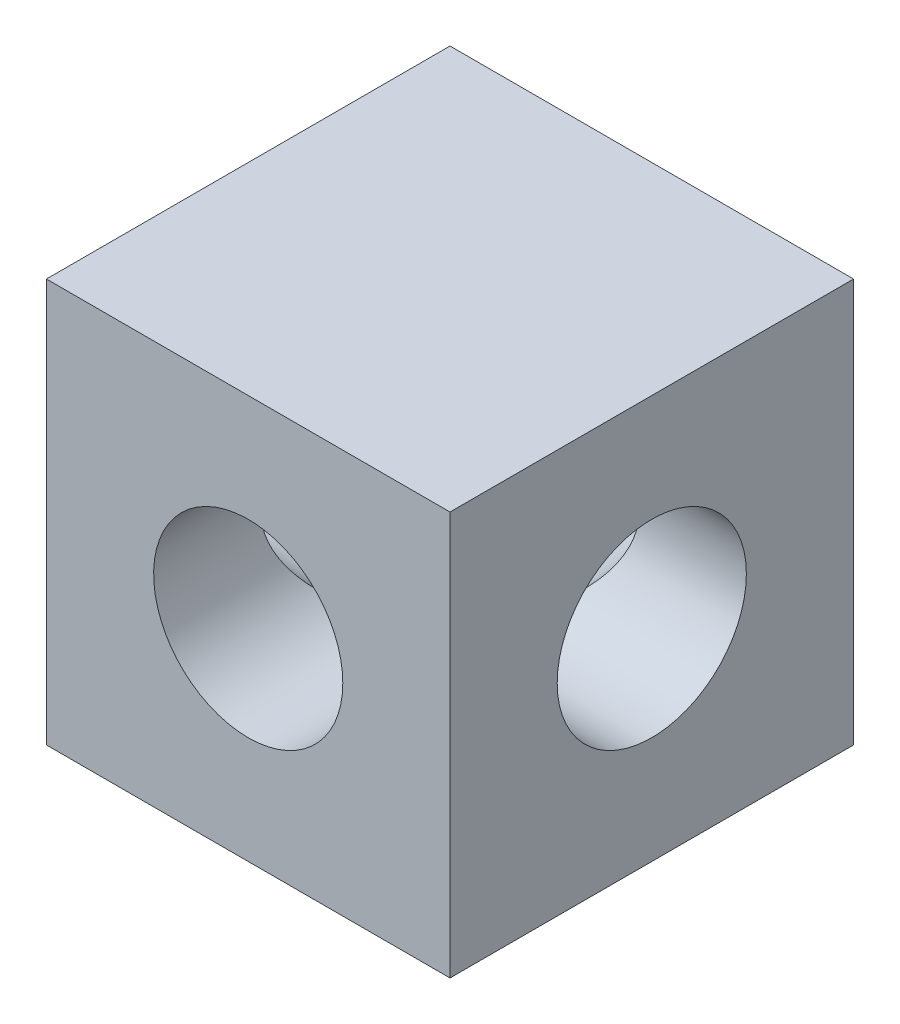
ISO-10303-21;
HEADER;
FILE_DESCRIPTION(('STEP AP214'),'2;1');
FILE_NAME('part.step','',(''),(''),'','','');
FILE_SCHEMA(('AUTOMOTIVE_DESIGN { 1 0 10303 214 1 1 1 1 }'));
ENDSEC;
DATA;
#1=APPLICATION_CONTEXT('core data for automotive mechanical design processes');
#2=APPLICATION_PROTOCOL_DEFINITION('international standard','automotive_design',2000,#1);
#3=PRODUCT_CONTEXT('',#1,'mechanical');
#4=PRODUCT('Part','Part','',(#3));
#5=PRODUCT_RELATED_PRODUCT_CATEGORY('part','',(#4));
#6=PRODUCT_DEFINITION_FORMATION('','',#4);
#7=PRODUCT_DEFINITION_CONTEXT('part definition',#1,'design');
#8=PRODUCT_DEFINITION('design','',#6,#7);
#9=PRODUCT_DEFINITION_SHAPE('','',#8);
#10=(LENGTH_UNIT() NAMED_UNIT(*) SI_UNIT(.MILLI.,.METRE.));
#11=(NAMED_UNIT(*) PLANE_ANGLE_UNIT() SI_UNIT($,.RADIAN.));
#12=(NAMED_UNIT(*) SI_UNIT($,.STERADIAN.) SOLID_ANGLE_UNIT());
#13=UNCERTAINTY_MEASURE_WITH_UNIT(LENGTH_MEASURE(1.E-05),#10,'distance_accuracy_value','');
#14=(GEOMETRIC_REPRESENTATION_CONTEXT(3) GLOBAL_UNCERTAINTY_ASSIGNED_CONTEXT((#13)) GLOBAL_UNIT_ASSIGNED_CONTEXT((#10,
#11,#12)) REPRESENTATION_CONTEXT('',''));
#15=CARTESIAN_POINT('',(0.,0.,0.));
#16=DIRECTION('',(0.,0.,1.));
#17=DIRECTION('',(1.,0.,0.));
#18=AXIS2_PLACEMENT_3D('',#15,#16,#17);
#19=CARTESIAN_POINT('',(0.,0.,10.16));
#20=DIRECTION('',(0.,0.,-0.999999999999999));
#21=DIRECTION('',(-1.,0.,0.));
#22=AXIS2_PLACEMENT_3D('',#19,#20,#21);
#23=CYLINDRICAL_SURFACE('',#22,4.7625);
#24=CARTESIAN_POINT('',(0.,0.,0.));
#25=DIRECTION('',(0.70710678118655,0.,-0.707106781186548));
#26=DIRECTION('',(-0.707106781186547,0.,-0.707106781186546));
#27=AXIS2_PLACEMENT_3D('',#24,#25,#26);
#28=ELLIPSE('',#27,6.73519209080187,4.7625);
#29=CARTESIAN_POINT('',(0.,-4.76250000000001,0.));
#30=VERTEX_POINT('',#29);
#31=CARTESIAN_POINT('',(0.,4.76250000000007,0.));
#32=VERTEX_POINT('',#31);
#33=EDGE_CURVE('E11',#30,#32,#28,.F.);
#34=ORIENTED_EDGE('',*,*,#33,.F.);
#35=CARTESIAN_POINT('',(0.,0.,0.));
#36=DIRECTION('',(-0.707106781186547,0.,-0.707106781186546));
#37=DIRECTION('',(0.70710678118655,0.,-0.707106781186548));
#38=AXIS2_PLACEMENT_3D('',#35,#36,#37);
#39=ELLIPSE('',#38,6.73519209080187,4.7625);
#40=EDGE_CURVE('E48',#32,#30,#39,.F.);
#41=ORIENTED_EDGE('',*,*,#40,.F.);
#42=EDGE_LOOP('',(#34,#41));
#43=FACE_BOUND('',#42,.T.);
#44=CARTESIAN_POINT('',(0.,0.,10.16));
#45=DIRECTION('',(0.,0.,0.999999999999999));
#46=DIRECTION('',(1.,0.,0.));
#47=AXIS2_PLACEMENT_3D('',#44,#45,#46);
#48=CIRCLE('',#47,4.7625);
#49=CARTESIAN_POINT('',(4.7625,0.,10.16));
#50=VERTEX_POINT('',#49);
#51=EDGE_CURVE('E125',#50,#50,#48,.T.);
#52=ORIENTED_EDGE('',*,*,#51,.T.);
#53=EDGE_LOOP('',(#52));
#54=FACE_BOUND('',#53,.T.);
#55=ADVANCED_FACE('F34',(#43,#54),#23,.F.);
#56=CARTESIAN_POINT('',(-10.16,10.16,10.16));
#57=DIRECTION('',(0.,0.,0.999999999999999));
#58=DIRECTION('',(1.,0.,0.));
#59=AXIS2_PLACEMENT_3D('',#56,#57,#58);
#60=PLANE('',#59);
#61=DIRECTION('',(0.,1.,0.));
#62=VECTOR('',#61,1.);
#63=CARTESIAN_POINT('',(-10.1600000000001,-10.16,10.16));
#64=LINE('',#63,#62);
#65=CARTESIAN_POINT('',(-10.1600000000001,-10.16,10.16));
#66=VERTEX_POINT('',#65);
#67=CARTESIAN_POINT('',(-10.16,10.16,10.16));
#68=VERTEX_POINT('',#67);
#69=EDGE_CURVE('E110',#66,#68,#64,.T.);
#70=ORIENTED_EDGE('',*,*,#69,.F.);
#71=DIRECTION('',(1.,0.,0.));
#72=VECTOR('',#71,1.);
#73=CARTESIAN_POINT('',(-10.1600000000001,-10.16,10.16));
#74=LINE('',#73,#72);
#75=CARTESIAN_POINT('',(10.16,-10.16,10.16));
#76=VERTEX_POINT('',#75);
#77=EDGE_CURVE('E99',#66,#76,#74,.T.);
#78=ORIENTED_EDGE('',*,*,#77,.T.);
#79=DIRECTION('',(0.,-1.,0.));
#80=VECTOR('',#79,1.);
#81=CARTESIAN_POINT('',(10.16,10.16,10.16));
#82=LINE('',#81,#80);
#83=CARTESIAN_POINT('',(10.16,10.16,10.16));
#84=VERTEX_POINT('',#83);
#85=EDGE_CURVE('E105',#84,#76,#82,.T.);
#86=ORIENTED_EDGE('',*,*,#85,.F.);
#87=DIRECTION('',(-1.,0.,0.));
#88=VECTOR('',#87,1.);
#89=CARTESIAN_POINT('',(10.16,10.16,10.16));
#90=LINE('',#89,#88);
#91=EDGE_CURVE('E108',#84,#68,#90,.T.);
#92=ORIENTED_EDGE('',*,*,#91,.T.);
#93=EDGE_LOOP('',(#70,#78,#86,#92));
#94=FACE_BOUND('',#93,.T.);
#95=ORIENTED_EDGE('',*,*,#51,.F.);
#96=EDGE_LOOP('',(#95));
#97=FACE_BOUND('',#96,.T.);
#98=ADVANCED_FACE('F157',(#94,#97),#60,.T.);
#99=CARTESIAN_POINT('',(-10.16,10.1600000000001,-10.16));
#100=DIRECTION('',(0.,0.,0.999999999999999));
#101=DIRECTION('',(1.,0.,0.));
#102=AXIS2_PLACEMENT_3D('',#99,#100,#101);
#103=PLANE('',#102);
#104=DIRECTION('',(0.,1.,0.));
#105=VECTOR('',#104,1.);
#106=CARTESIAN_POINT('',(-10.16,-10.16,-10.16));
#107=LINE('',#106,#105);
#108=CARTESIAN_POINT('',(-10.16,-10.16,-10.16));
#109=VERTEX_POINT('',#108);
#110=CARTESIAN_POINT('',(-10.16,10.1600000000001,-10.16));
#111=VERTEX_POINT('',#110);
#112=EDGE_CURVE('E122',#109,#111,#107,.T.);
#113=ORIENTED_EDGE('',*,*,#112,.T.);
#114=DIRECTION('',(-1.,0.,0.));
#115=VECTOR('',#114,1.);
#116=CARTESIAN_POINT('',(10.16,10.16,-10.16));
#117=LINE('',#116,#115);
#118=CARTESIAN_POINT('',(10.16,10.16,-10.16));
#119=VERTEX_POINT('',#118);
#120=EDGE_CURVE('E119',#119,#111,#117,.T.);
#121=ORIENTED_EDGE('',*,*,#120,.F.);
#122=DIRECTION('',(0.,-1.,0.));
#123=VECTOR('',#122,1.);
#124=CARTESIAN_POINT('',(10.16,10.16,-10.16));
#125=LINE('',#124,#123);
#126=CARTESIAN_POINT('',(10.16,-10.16,-10.16));
#127=VERTEX_POINT('',#126);
#128=EDGE_CURVE('E116',#119,#127,#125,.T.);
#129=ORIENTED_EDGE('',*,*,#128,.T.);
#130=DIRECTION('',(1.,0.,0.));
#131=VECTOR('',#130,1.);
#132=CARTESIAN_POINT('',(-10.16,-10.16,-10.16));
#133=LINE('',#132,#131);
#134=EDGE_CURVE('E113',#109,#127,#133,.T.);
#135=ORIENTED_EDGE('',*,*,#134,.F.);
#136=EDGE_LOOP('',(#113,#121,#129,#135));
#137=FACE_BOUND('',#136,.T.);
#138=CARTESIAN_POINT('',(0.,0.,-10.16));
#139=DIRECTION('',(0.,0.,0.999999999999999));
#140=DIRECTION('',(1.,0.,0.));
#141=AXIS2_PLACEMENT_3D('',#138,#139,#140);
#142=CIRCLE('',#141,4.7625);
#143=CARTESIAN_POINT('',(4.76250000000001,0.,-10.16));
#144=VERTEX_POINT('',#143);
#145=EDGE_CURVE('E128',#144,#144,#142,.T.);
#146=ORIENTED_EDGE('',*,*,#145,.T.);
#147=EDGE_LOOP('',(#146));
#148=FACE_BOUND('',#147,.T.);
#149=ADVANCED_FACE('F150',(#137,#148),#103,.F.);
#150=CARTESIAN_POINT('',(-10.1600000000001,-10.16,10.16));
#151=DIRECTION('',(-1.,0.,0.));
#152=DIRECTION('',(0.,-1.,0.));
#153=AXIS2_PLACEMENT_3D('',#150,#151,#152);
#154=PLANE('',#153);
#155=CARTESIAN_POINT('',(-10.16,0.,0.));
#156=DIRECTION('',(1.,0.,0.));
#157=DIRECTION('',(0.,0.,-0.999999999999999));
#158=AXIS2_PLACEMENT_3D('',#155,#156,#157);
#159=CIRCLE('',#158,4.7625);
#160=CARTESIAN_POINT('',(-10.16,0.,-4.76249999999997));
#161=VERTEX_POINT('',#160);
#162=EDGE_CURVE('E131',#161,#161,#159,.T.);
#163=ORIENTED_EDGE('',*,*,#162,.T.);
#164=EDGE_LOOP('',(#163));
#165=FACE_BOUND('',#164,.T.);
#166=ORIENTED_EDGE('',*,*,#112,.F.);
#167=DIRECTION('',(0.,0.,-0.999999999999999));
#168=VECTOR('',#167,1.);
#169=CARTESIAN_POINT('',(-10.1600000000001,-10.16,10.16));
#170=LINE('',#169,#168);
#171=EDGE_CURVE('E56',#66,#109,#170,.T.);
#172=ORIENTED_EDGE('',*,*,#171,.F.);
#173=ORIENTED_EDGE('',*,*,#69,.T.);
#174=DIRECTION('',(0.,0.,-0.999999999999999));
#175=VECTOR('',#174,1.);
#176=CARTESIAN_POINT('',(-10.16,10.16,10.16));
#177=LINE('',#176,#175);
#178=EDGE_CURVE('E96',#68,#111,#177,.T.);
#179=ORIENTED_EDGE('',*,*,#178,.T.);
#180=EDGE_LOOP('',(#166,#172,#173,#179));
#181=FACE_BOUND('',#180,.T.);
#182=ADVANCED_FACE('F36',(#165,#181),#154,.T.);
#183=CARTESIAN_POINT('',(-10.1600000000001,-10.16,10.16));
#184=DIRECTION('',(0.,1.,0.));
#185=DIRECTION('',(0.,0.,0.999999999999999));
#186=AXIS2_PLACEMENT_3D('',#183,#184,#185);
#187=PLANE('',#186);
#188=ORIENTED_EDGE('',*,*,#134,.T.);
#189=DIRECTION('',(0.,0.,-0.999999999999999));
#190=VECTOR('',#189,1.);
#191=CARTESIAN_POINT('',(10.16,-10.16,10.16));
#192=LINE('',#191,#190);
#193=EDGE_CURVE('E101',#76,#127,#192,.T.);
#194=ORIENTED_EDGE('',*,*,#193,.F.);
#195=ORIENTED_EDGE('',*,*,#77,.F.);
#196=ORIENTED_EDGE('',*,*,#171,.T.);
#197=EDGE_LOOP('',(#188,#194,#195,#196));
#198=FACE_BOUND('',#197,.T.);
#199=ADVANCED_FACE('F142',(#198),#187,.F.);
#200=CARTESIAN_POINT('',(10.16,10.16,10.16));
#201=DIRECTION('',(1.,0.,0.));
#202=DIRECTION('',(0.,0.,-0.999999999999999));
#203=AXIS2_PLACEMENT_3D('',#200,#201,#202);
#204=PLANE('',#203);
#205=CARTESIAN_POINT('',(10.16,0.,0.));
#206=DIRECTION('',(1.,0.,0.));
#207=DIRECTION('',(0.,0.,-0.999999999999999));
#208=AXIS2_PLACEMENT_3D('',#205,#206,#207);
#209=CIRCLE('',#208,4.7625);
#210=CARTESIAN_POINT('',(10.16,0.,-4.76250000000002));
#211=VERTEX_POINT('',#210);
#212=EDGE_CURVE('E134',#211,#211,#209,.T.);
#213=ORIENTED_EDGE('',*,*,#212,.F.);
#214=EDGE_LOOP('',(#213));
#215=FACE_BOUND('',#214,.T.);
#216=ORIENTED_EDGE('',*,*,#128,.F.);
#217=DIRECTION('',(0.,0.,-0.999999999999999));
#218=VECTOR('',#217,1.);
#219=CARTESIAN_POINT('',(10.16,10.16,10.16));
#220=LINE('',#219,#218);
#221=EDGE_CURVE('E98',#84,#119,#220,.T.);
#222=ORIENTED_EDGE('',*,*,#221,.F.);
#223=ORIENTED_EDGE('',*,*,#85,.T.);
#224=ORIENTED_EDGE('',*,*,#193,.T.);
#225=EDGE_LOOP('',(#216,#222,#223,#224));
#226=FACE_BOUND('',#225,.T.);
#227=ADVANCED_FACE('F138',(#215,#226),#204,.T.);
#228=CARTESIAN_POINT('',(10.16,10.16,10.16));
#229=DIRECTION('',(0.,-1.,0.));
#230=DIRECTION('',(0.,0.,-0.999999999999999));
#231=AXIS2_PLACEMENT_3D('',#228,#229,#230);
#232=PLANE('',#231);
#233=ORIENTED_EDGE('',*,*,#120,.T.);
#234=ORIENTED_EDGE('',*,*,#178,.F.);
#235=ORIENTED_EDGE('',*,*,#91,.F.);
#236=ORIENTED_EDGE('',*,*,#221,.T.);
#237=EDGE_LOOP('',(#233,#234,#235,#236));
#238=FACE_BOUND('',#237,.T.);
#239=ADVANCED_FACE('F141',(#238),#232,.F.);
#240=CARTESIAN_POINT('',(0.,0.,0.));
#241=DIRECTION('',(0.70710678118655,0.,-0.707106781186548));
#242=DIRECTION('',(-0.707106781186547,0.,-0.707106781186546));
#243=AXIS2_PLACEMENT_3D('',#240,#241,#242);
#244=ELLIPSE('',#243,6.73519209080187,4.7625);
#245=EDGE_CURVE('E42',#30,#32,#244,.T.);
#246=ORIENTED_EDGE('',*,*,#245,.F.);
#247=CARTESIAN_POINT('',(0.,0.,0.));
#248=DIRECTION('',(-0.707106781186547,0.,-0.707106781186546));
#249=DIRECTION('',(0.70710678118655,0.,-0.707106781186548));
#250=AXIS2_PLACEMENT_3D('',#247,#248,#249);
#251=ELLIPSE('',#250,6.73519209080187,4.7625);
#252=EDGE_CURVE('E82',#32,#30,#251,.T.);
#253=ORIENTED_EDGE('',*,*,#252,.F.);
#254=EDGE_LOOP('',(#246,#253));
#255=FACE_BOUND('',#254,.T.);
#256=ORIENTED_EDGE('',*,*,#145,.F.);
#257=EDGE_LOOP('',(#256));
#258=FACE_BOUND('',#257,.T.);
#259=ADVANCED_FACE('F93',(#255,#258),#23,.F.);
#260=CARTESIAN_POINT('',(-10.16,0.,0.));
#261=DIRECTION('',(1.,0.,0.));
#262=DIRECTION('',(0.,0.,-0.999999999999999));
#263=AXIS2_PLACEMENT_3D('',#260,#261,#262);
#264=CYLINDRICAL_SURFACE('',#263,4.7625);
#265=ORIENTED_EDGE('',*,*,#245,.T.);
#266=ORIENTED_EDGE('',*,*,#40,.T.);
#267=EDGE_LOOP('',(#265,#266));
#268=FACE_BOUND('',#267,.T.);
#269=ORIENTED_EDGE('',*,*,#162,.F.);
#270=EDGE_LOOP('',(#269));
#271=FACE_BOUND('',#270,.T.);
#272=ADVANCED_FACE('F89',(#268,#271),#264,.F.);
#273=ORIENTED_EDGE('',*,*,#33,.T.);
#274=ORIENTED_EDGE('',*,*,#252,.T.);
#275=EDGE_LOOP('',(#273,#274));
#276=FACE_BOUND('',#275,.T.);
#277=ORIENTED_EDGE('',*,*,#212,.T.);
#278=EDGE_LOOP('',(#277));
#279=FACE_BOUND('',#278,.T.);
#280=ADVANCED_FACE('F83',(#276,#279),#264,.F.);
#281=CLOSED_SHELL('',(#55,#98,#149,#182,#199,#227,#239,#259,#272,#280));
#282=MANIFOLD_SOLID_BREP('B2',#281);
#283=ADVANCED_BREP_SHAPE_REPRESENTATION('',(#18,#282),#14);
#284=SHAPE_DEFINITION_REPRESENTATION(#9,#283);
ENDSEC;
END-ISO-10303-21;
